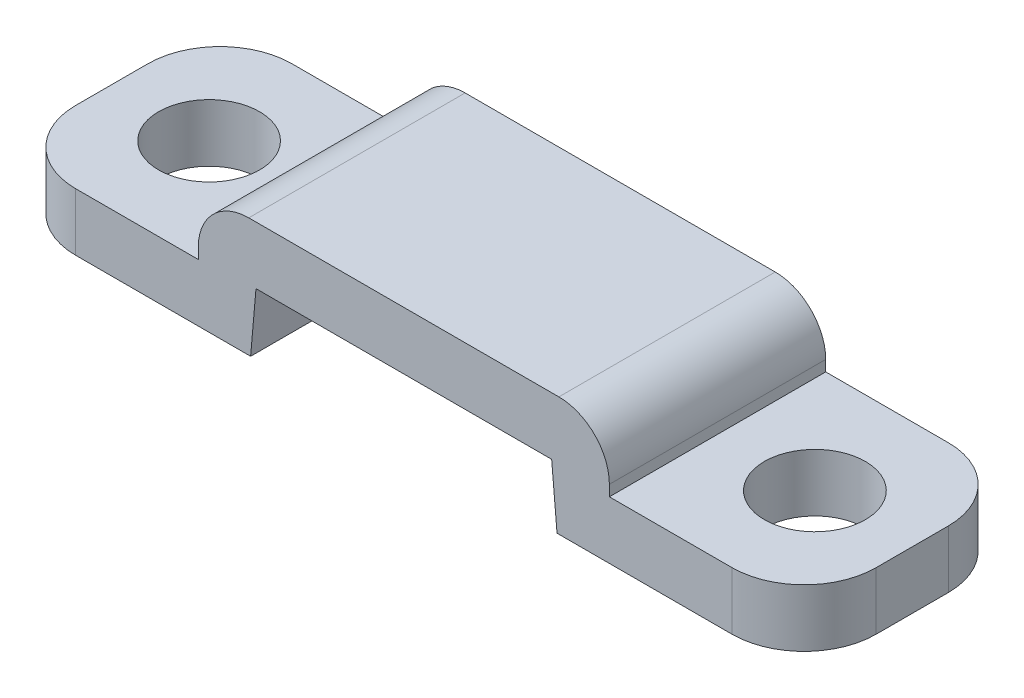
ISO-10303-21;
HEADER;
FILE_DESCRIPTION(('STEP AP214'),'2;1');
FILE_NAME('part.step','',(''),(''),'','','');
FILE_SCHEMA(('AUTOMOTIVE_DESIGN { 1 0 10303 214 1 1 1 1 }'));
ENDSEC;
DATA;
#1=APPLICATION_CONTEXT('core data for automotive mechanical design processes');
#2=APPLICATION_PROTOCOL_DEFINITION('international standard','automotive_design',2000,#1);
#3=PRODUCT_CONTEXT('',#1,'mechanical');
#4=PRODUCT('Part','Part','',(#3));
#5=PRODUCT_RELATED_PRODUCT_CATEGORY('part','',(#4));
#6=PRODUCT_DEFINITION_FORMATION('','',#4);
#7=PRODUCT_DEFINITION_CONTEXT('part definition',#1,'design');
#8=PRODUCT_DEFINITION('design','',#6,#7);
#9=PRODUCT_DEFINITION_SHAPE('','',#8);
#10=(LENGTH_UNIT() NAMED_UNIT(*) SI_UNIT(.MILLI.,.METRE.));
#11=(NAMED_UNIT(*) PLANE_ANGLE_UNIT() SI_UNIT($,.RADIAN.));
#12=(NAMED_UNIT(*) SI_UNIT($,.STERADIAN.) SOLID_ANGLE_UNIT());
#13=UNCERTAINTY_MEASURE_WITH_UNIT(LENGTH_MEASURE(1.E-05),#10,'distance_accuracy_value','');
#14=(GEOMETRIC_REPRESENTATION_CONTEXT(3) GLOBAL_UNCERTAINTY_ASSIGNED_CONTEXT((#13)) GLOBAL_UNIT_ASSIGNED_CONTEXT((#10,
#11,#12)) REPRESENTATION_CONTEXT('',''));
#15=CARTESIAN_POINT('',(0.,0.,0.));
#16=DIRECTION('',(0.,0.,1.));
#17=DIRECTION('',(1.,0.,0.));
#18=AXIS2_PLACEMENT_3D('',#15,#16,#17);
#19=CARTESIAN_POINT('',(5.207,-1.0795,7.62));
#20=DIRECTION('',(0.,1.,0.));
#21=DIRECTION('',(0.,0.,1.));
#22=AXIS2_PLACEMENT_3D('',#19,#20,#21);
#23=PLANE('',#22);
#24=CARTESIAN_POINT('',(10.668,-1.0795,3.81));
#25=DIRECTION('',(0.,1.,0.));
#26=DIRECTION('',(-1.,0.,0.));
#27=AXIS2_PLACEMENT_3D('',#24,#25,#26);
#28=CIRCLE('',#27,1.778);
#29=CARTESIAN_POINT('',(8.89,-1.0795,3.81));
#30=VERTEX_POINT('',#29);
#31=EDGE_CURVE('E417',#30,#30,#28,.T.);
#32=ORIENTED_EDGE('',*,*,#31,.T.);
#33=EDGE_LOOP('',(#32));
#34=FACE_BOUND('',#33,.T.);
#35=DIRECTION('',(0.,0.,-1.));
#36=VECTOR('',#35,1.);
#37=CARTESIAN_POINT('',(14.097,-1.0795,7.62));
#38=LINE('',#37,#36);
#39=CARTESIAN_POINT('',(14.097,-1.0795,5.08));
#40=VERTEX_POINT('',#39);
#41=CARTESIAN_POINT('',(14.097,-1.0795,2.54));
#42=VERTEX_POINT('',#41);
#43=EDGE_CURVE('E227',#40,#42,#38,.T.);
#44=ORIENTED_EDGE('',*,*,#43,.F.);
#45=CARTESIAN_POINT('',(11.557,-1.0795,5.08));
#46=DIRECTION('',(0.,1.,0.));
#47=DIRECTION('',(0.,0.,1.));
#48=AXIS2_PLACEMENT_3D('',#45,#46,#47);
#49=CIRCLE('',#48,2.54);
#50=CARTESIAN_POINT('',(11.557,-1.0795,7.62));
#51=VERTEX_POINT('',#50);
#52=EDGE_CURVE('E247',#40,#51,#49,.F.);
#53=ORIENTED_EDGE('',*,*,#52,.T.);
#54=DIRECTION('',(1.,0.,0.));
#55=VECTOR('',#54,1.);
#56=CARTESIAN_POINT('',(5.207,-1.0795,7.62));
#57=LINE('',#56,#55);
#58=CARTESIAN_POINT('',(5.39588802455247,-1.0795,7.62));
#59=VERTEX_POINT('',#58);
#60=EDGE_CURVE('E190',#59,#51,#57,.T.);
#61=ORIENTED_EDGE('',*,*,#60,.F.);
#62=DIRECTION('',(0.,0.,1.));
#63=VECTOR('',#62,1.);
#64=CARTESIAN_POINT('',(5.39588802455247,-1.0795,7.62));
#65=LINE('',#64,#63);
#66=CARTESIAN_POINT('',(5.39588802455247,-1.0795,0.));
#67=VERTEX_POINT('',#66);
#68=EDGE_CURVE('E194',#59,#67,#65,.F.);
#69=ORIENTED_EDGE('',*,*,#68,.T.);
#70=DIRECTION('',(1.,0.,0.));
#71=VECTOR('',#70,1.);
#72=CARTESIAN_POINT('',(5.207,-1.0795,0.));
#73=LINE('',#72,#71);
#74=CARTESIAN_POINT('',(11.557,-1.0795,0.));
#75=VERTEX_POINT('',#74);
#76=EDGE_CURVE('E296',#67,#75,#73,.T.);
#77=ORIENTED_EDGE('',*,*,#76,.T.);
#78=CARTESIAN_POINT('',(11.557,-1.0795,2.54));
#79=DIRECTION('',(0.,1.,0.));
#80=DIRECTION('',(0.,0.,1.));
#81=AXIS2_PLACEMENT_3D('',#78,#79,#80);
#82=CIRCLE('',#81,2.54);
#83=EDGE_CURVE('E245',#75,#42,#82,.F.);
#84=ORIENTED_EDGE('',*,*,#83,.T.);
#85=EDGE_LOOP('',(#44,#53,#61,#69,#77,#84));
#86=FACE_BOUND('',#85,.T.);
#87=ADVANCED_FACE('F33',(#34,#86),#23,.F.);
#88=CARTESIAN_POINT('',(14.097,-1.0795,7.62));
#89=DIRECTION('',(-1.,0.,0.));
#90=DIRECTION('',(0.,0.,1.));
#91=AXIS2_PLACEMENT_3D('',#88,#89,#90);
#92=PLANE('',#91);
#93=DIRECTION('',(0.,0.,-1.));
#94=VECTOR('',#93,1.);
#95=CARTESIAN_POINT('',(14.097,0.952499999999998,7.62));
#96=LINE('',#95,#94);
#97=CARTESIAN_POINT('',(14.097,0.952499999999998,5.08));
#98=VERTEX_POINT('',#97);
#99=CARTESIAN_POINT('',(14.097,0.952499999999998,2.54));
#100=VERTEX_POINT('',#99);
#101=EDGE_CURVE('E224',#98,#100,#96,.T.);
#102=ORIENTED_EDGE('',*,*,#101,.F.);
#103=DIRECTION('',(0.,1.,0.));
#104=VECTOR('',#103,1.);
#105=CARTESIAN_POINT('',(14.097,-1.0795,5.08));
#106=LINE('',#105,#104);
#107=EDGE_CURVE('E243',#98,#40,#106,.F.);
#108=ORIENTED_EDGE('',*,*,#107,.T.);
#109=ORIENTED_EDGE('',*,*,#43,.T.);
#110=DIRECTION('',(0.,1.,0.));
#111=VECTOR('',#110,1.);
#112=CARTESIAN_POINT('',(14.097,-1.0795,2.54));
#113=LINE('',#112,#111);
#114=EDGE_CURVE('E240',#42,#100,#113,.T.);
#115=ORIENTED_EDGE('',*,*,#114,.T.);
#116=EDGE_LOOP('',(#102,#108,#109,#115));
#117=FACE_BOUND('',#116,.T.);
#118=ADVANCED_FACE('F323',(#117),#92,.F.);
#119=CARTESIAN_POINT('',(14.097,0.952499999999998,7.62));
#120=DIRECTION('',(0.,-1.,0.));
#121=DIRECTION('',(1.,0.,0.));
#122=AXIS2_PLACEMENT_3D('',#119,#120,#121);
#123=PLANE('',#122);
#124=CARTESIAN_POINT('',(10.668,0.952499999999999,3.81));
#125=DIRECTION('',(0.,1.,0.));
#126=DIRECTION('',(-1.,0.,0.));
#127=AXIS2_PLACEMENT_3D('',#124,#125,#126);
#128=CIRCLE('',#127,1.778);
#129=CARTESIAN_POINT('',(8.89,0.952499999999998,3.81));
#130=VERTEX_POINT('',#129);
#131=EDGE_CURVE('E420',#130,#130,#128,.T.);
#132=ORIENTED_EDGE('',*,*,#131,.F.);
#133=EDGE_LOOP('',(#132));
#134=FACE_BOUND('',#133,.T.);
#135=DIRECTION('',(-1.,0.,0.));
#136=VECTOR('',#135,1.);
#137=CARTESIAN_POINT('',(14.097,0.952499999999998,7.62));
#138=LINE('',#137,#136);
#139=CARTESIAN_POINT('',(11.557,0.952499999999998,7.62));
#140=VERTEX_POINT('',#139);
#141=CARTESIAN_POINT('',(7.239,0.952499999999997,7.62));
#142=VERTEX_POINT('',#141);
#143=EDGE_CURVE('E329',#140,#142,#138,.T.);
#144=ORIENTED_EDGE('',*,*,#143,.F.);
#145=CARTESIAN_POINT('',(11.557,0.952499999999998,5.08));
#146=DIRECTION('',(0.,-1.,0.));
#147=DIRECTION('',(1.,0.,0.));
#148=AXIS2_PLACEMENT_3D('',#145,#146,#147);
#149=CIRCLE('',#148,2.54);
#150=EDGE_CURVE('E238',#140,#98,#149,.F.);
#151=ORIENTED_EDGE('',*,*,#150,.T.);
#152=ORIENTED_EDGE('',*,*,#101,.T.);
#153=CARTESIAN_POINT('',(11.557,0.952499999999998,2.54));
#154=DIRECTION('',(0.,-1.,0.));
#155=DIRECTION('',(1.,0.,0.));
#156=AXIS2_PLACEMENT_3D('',#153,#154,#155);
#157=CIRCLE('',#156,2.54);
#158=CARTESIAN_POINT('',(11.557,0.952499999999998,0.));
#159=VERTEX_POINT('',#158);
#160=EDGE_CURVE('E236',#100,#159,#157,.F.);
#161=ORIENTED_EDGE('',*,*,#160,.T.);
#162=DIRECTION('',(-1.,0.,0.));
#163=VECTOR('',#162,1.);
#164=CARTESIAN_POINT('',(14.097,0.952499999999998,0.));
#165=LINE('',#164,#163);
#166=CARTESIAN_POINT('',(7.239,0.952499999999997,0.));
#167=VERTEX_POINT('',#166);
#168=EDGE_CURVE('E179',#159,#167,#165,.T.);
#169=ORIENTED_EDGE('',*,*,#168,.T.);
#170=DIRECTION('',(0.,0.,-1.));
#171=VECTOR('',#170,1.);
#172=CARTESIAN_POINT('',(7.239,0.952499999999997,7.62));
#173=LINE('',#172,#171);
#174=EDGE_CURVE('E178',#142,#167,#173,.T.);
#175=ORIENTED_EDGE('',*,*,#174,.F.);
#176=EDGE_LOOP('',(#144,#151,#152,#161,#169,#175));
#177=FACE_BOUND('',#176,.T.);
#178=ADVANCED_FACE('F327',(#134,#177),#123,.F.);
#179=CARTESIAN_POINT('',(7.239,3.1115,7.62));
#180=DIRECTION('',(-1.,0.,0.));
#181=DIRECTION('',(0.,0.,1.));
#182=AXIS2_PLACEMENT_3D('',#179,#180,#181);
#183=PLANE('',#182);
#184=DIRECTION('',(0.,1.,0.));
#185=VECTOR('',#184,1.);
#186=CARTESIAN_POINT('',(7.239,3.1115,0.));
#187=LINE('',#186,#185);
#188=CARTESIAN_POINT('',(7.239,1.3335,0.));
#189=VERTEX_POINT('',#188);
#190=EDGE_CURVE('E162',#167,#189,#187,.T.);
#191=ORIENTED_EDGE('',*,*,#190,.T.);
#192=DIRECTION('',(0.,0.,-1.));
#193=VECTOR('',#192,1.);
#194=CARTESIAN_POINT('',(7.239,1.3335,7.62));
#195=LINE('',#194,#193);
#196=CARTESIAN_POINT('',(7.239,1.3335,7.62));
#197=VERTEX_POINT('',#196);
#198=EDGE_CURVE('E169',#189,#197,#195,.F.);
#199=ORIENTED_EDGE('',*,*,#198,.T.);
#200=DIRECTION('',(0.,1.,0.));
#201=VECTOR('',#200,1.);
#202=CARTESIAN_POINT('',(7.239,3.1115,7.62));
#203=LINE('',#202,#201);
#204=EDGE_CURVE('E288',#142,#197,#203,.T.);
#205=ORIENTED_EDGE('',*,*,#204,.F.);
#206=ORIENTED_EDGE('',*,*,#174,.T.);
#207=EDGE_LOOP('',(#191,#199,#205,#206));
#208=FACE_BOUND('',#207,.T.);
#209=ADVANCED_FACE('F174',(#208),#183,.F.);
#210=CARTESIAN_POINT('',(-7.239,3.1115,7.62));
#211=DIRECTION('',(0.,-1.,0.));
#212=DIRECTION('',(0.,0.,-1.));
#213=AXIS2_PLACEMENT_3D('',#210,#211,#212);
#214=PLANE('',#213);
#215=DIRECTION('',(-1.,0.,0.));
#216=VECTOR('',#215,1.);
#217=CARTESIAN_POINT('',(-7.239,3.1115,7.62));
#218=LINE('',#217,#216);
#219=CARTESIAN_POINT('',(5.461,3.1115,7.62));
#220=VERTEX_POINT('',#219);
#221=CARTESIAN_POINT('',(-5.461,3.1115,7.62));
#222=VERTEX_POINT('',#221);
#223=EDGE_CURVE('E284',#220,#222,#218,.T.);
#224=ORIENTED_EDGE('',*,*,#223,.F.);
#225=DIRECTION('',(0.,0.,-1.));
#226=VECTOR('',#225,1.);
#227=CARTESIAN_POINT('',(5.461,3.1115,7.62));
#228=LINE('',#227,#226);
#229=CARTESIAN_POINT('',(5.461,3.1115,0.));
#230=VERTEX_POINT('',#229);
#231=EDGE_CURVE('E268',#220,#230,#228,.T.);
#232=ORIENTED_EDGE('',*,*,#231,.T.);
#233=DIRECTION('',(-1.,0.,0.));
#234=VECTOR('',#233,1.);
#235=CARTESIAN_POINT('',(-7.239,3.1115,0.));
#236=LINE('',#235,#234);
#237=CARTESIAN_POINT('',(-5.461,3.1115,0.));
#238=VERTEX_POINT('',#237);
#239=EDGE_CURVE('E164',#230,#238,#236,.T.);
#240=ORIENTED_EDGE('',*,*,#239,.T.);
#241=DIRECTION('',(0.,0.,-1.));
#242=VECTOR('',#241,1.);
#243=CARTESIAN_POINT('',(-5.461,3.1115,7.62));
#244=LINE('',#243,#242);
#245=EDGE_CURVE('E266',#238,#222,#244,.F.);
#246=ORIENTED_EDGE('',*,*,#245,.T.);
#247=EDGE_LOOP('',(#224,#232,#240,#246));
#248=FACE_BOUND('',#247,.T.);
#249=ADVANCED_FACE('F275',(#248),#214,.F.);
#250=CARTESIAN_POINT('',(-7.239,0.952499999999998,7.62));
#251=DIRECTION('',(1.,0.,0.));
#252=DIRECTION('',(0.,0.,-1.));
#253=AXIS2_PLACEMENT_3D('',#250,#251,#252);
#254=PLANE('',#253);
#255=DIRECTION('',(0.,-1.,0.));
#256=VECTOR('',#255,1.);
#257=CARTESIAN_POINT('',(-7.239,0.952499999999998,7.62));
#258=LINE('',#257,#256);
#259=CARTESIAN_POINT('',(-7.239,1.3335,7.62));
#260=VERTEX_POINT('',#259);
#261=CARTESIAN_POINT('',(-7.239,0.952499999999998,7.62));
#262=VERTEX_POINT('',#261);
#263=EDGE_CURVE('E279',#260,#262,#258,.T.);
#264=ORIENTED_EDGE('',*,*,#263,.F.);
#265=DIRECTION('',(0.,0.,-1.));
#266=VECTOR('',#265,1.);
#267=CARTESIAN_POINT('',(-7.239,1.3335,7.62));
#268=LINE('',#267,#266);
#269=CARTESIAN_POINT('',(-7.239,1.3335,0.));
#270=VERTEX_POINT('',#269);
#271=EDGE_CURVE('E11',#260,#270,#268,.T.);
#272=ORIENTED_EDGE('',*,*,#271,.T.);
#273=DIRECTION('',(0.,-1.,0.));
#274=VECTOR('',#273,1.);
#275=CARTESIAN_POINT('',(-7.239,0.952499999999998,0.));
#276=LINE('',#275,#274);
#277=CARTESIAN_POINT('',(-7.239,0.952499999999998,0.));
#278=VERTEX_POINT('',#277);
#279=EDGE_CURVE('E86',#270,#278,#276,.T.);
#280=ORIENTED_EDGE('',*,*,#279,.T.);
#281=DIRECTION('',(0.,0.,-1.));
#282=VECTOR('',#281,1.);
#283=CARTESIAN_POINT('',(-7.239,0.952499999999998,7.62));
#284=LINE('',#283,#282);
#285=EDGE_CURVE('E221',#262,#278,#284,.T.);
#286=ORIENTED_EDGE('',*,*,#285,.F.);
#287=EDGE_LOOP('',(#264,#272,#280,#286));
#288=FACE_BOUND('',#287,.T.);
#289=ADVANCED_FACE('F278',(#288),#254,.F.);
#290=CARTESIAN_POINT('',(-14.097,0.952499999999998,7.62));
#291=DIRECTION('',(0.,-1.,0.));
#292=DIRECTION('',(0.,0.,-1.));
#293=AXIS2_PLACEMENT_3D('',#290,#291,#292);
#294=PLANE('',#293);
#295=CARTESIAN_POINT('',(-10.668,0.952499999999997,3.81));
#296=DIRECTION('',(0.,1.,0.));
#297=DIRECTION('',(-1.,0.,0.));
#298=AXIS2_PLACEMENT_3D('',#295,#296,#297);
#299=CIRCLE('',#298,1.778);
#300=CARTESIAN_POINT('',(-12.446,0.952499999999997,3.81));
#301=VERTEX_POINT('',#300);
#302=EDGE_CURVE('E339',#301,#301,#299,.T.);
#303=ORIENTED_EDGE('',*,*,#302,.F.);
#304=EDGE_LOOP('',(#303));
#305=FACE_BOUND('',#304,.T.);
#306=DIRECTION('',(-1.,0.,0.));
#307=VECTOR('',#306,1.);
#308=CARTESIAN_POINT('',(-14.097,0.952499999999998,0.));
#309=LINE('',#308,#307);
#310=CARTESIAN_POINT('',(-11.557,0.952499999999998,0.));
#311=VERTEX_POINT('',#310);
#312=EDGE_CURVE('E302',#278,#311,#309,.T.);
#313=ORIENTED_EDGE('',*,*,#312,.T.);
#314=CARTESIAN_POINT('',(-11.557,0.952499999999998,2.54));
#315=DIRECTION('',(0.,-1.,0.));
#316=DIRECTION('',(0.,0.,-1.));
#317=AXIS2_PLACEMENT_3D('',#314,#315,#316);
#318=CIRCLE('',#317,2.54);
#319=CARTESIAN_POINT('',(-14.097,0.952499999999998,2.54));
#320=VERTEX_POINT('',#319);
#321=EDGE_CURVE('E264',#311,#320,#318,.F.);
#322=ORIENTED_EDGE('',*,*,#321,.T.);
#323=DIRECTION('',(0.,0.,-1.));
#324=VECTOR('',#323,1.);
#325=CARTESIAN_POINT('',(-14.097,0.952499999999998,7.62));
#326=LINE('',#325,#324);
#327=CARTESIAN_POINT('',(-14.097,0.952499999999998,5.08));
#328=VERTEX_POINT('',#327);
#329=EDGE_CURVE('E207',#328,#320,#326,.T.);
#330=ORIENTED_EDGE('',*,*,#329,.F.);
#331=CARTESIAN_POINT('',(-11.557,0.952499999999998,5.08));
#332=DIRECTION('',(0.,-1.,0.));
#333=DIRECTION('',(0.,0.,-1.));
#334=AXIS2_PLACEMENT_3D('',#331,#332,#333);
#335=CIRCLE('',#334,2.54);
#336=CARTESIAN_POINT('',(-11.557,0.952499999999998,7.62));
#337=VERTEX_POINT('',#336);
#338=EDGE_CURVE('E262',#328,#337,#335,.F.);
#339=ORIENTED_EDGE('',*,*,#338,.T.);
#340=DIRECTION('',(-1.,0.,0.));
#341=VECTOR('',#340,1.);
#342=CARTESIAN_POINT('',(-14.097,0.952499999999998,7.62));
#343=LINE('',#342,#341);
#344=EDGE_CURVE('E283',#262,#337,#343,.T.);
#345=ORIENTED_EDGE('',*,*,#344,.F.);
#346=ORIENTED_EDGE('',*,*,#285,.T.);
#347=EDGE_LOOP('',(#313,#322,#330,#339,#345,#346));
#348=FACE_BOUND('',#347,.T.);
#349=ADVANCED_FACE('F354',(#305,#348),#294,.F.);
#350=CARTESIAN_POINT('',(-14.097,-1.0795,7.62));
#351=DIRECTION('',(1.,0.,0.));
#352=DIRECTION('',(0.,1.,0.));
#353=AXIS2_PLACEMENT_3D('',#350,#351,#352);
#354=PLANE('',#353);
#355=ORIENTED_EDGE('',*,*,#329,.T.);
#356=DIRECTION('',(0.,-1.,0.));
#357=VECTOR('',#356,1.);
#358=CARTESIAN_POINT('',(-14.097,-1.0795,2.54));
#359=LINE('',#358,#357);
#360=CARTESIAN_POINT('',(-14.097,-1.0795,2.54));
#361=VERTEX_POINT('',#360);
#362=EDGE_CURVE('E255',#320,#361,#359,.T.);
#363=ORIENTED_EDGE('',*,*,#362,.T.);
#364=DIRECTION('',(0.,0.,-1.));
#365=VECTOR('',#364,1.);
#366=CARTESIAN_POINT('',(-14.097,-1.0795,7.62));
#367=LINE('',#366,#365);
#368=CARTESIAN_POINT('',(-14.097,-1.0795,5.08));
#369=VERTEX_POINT('',#368);
#370=EDGE_CURVE('E201',#369,#361,#367,.T.);
#371=ORIENTED_EDGE('',*,*,#370,.F.);
#372=DIRECTION('',(0.,-1.,0.));
#373=VECTOR('',#372,1.);
#374=CARTESIAN_POINT('',(-14.097,0.952499999999998,5.08));
#375=LINE('',#374,#373);
#376=EDGE_CURVE('E253',#369,#328,#375,.F.);
#377=ORIENTED_EDGE('',*,*,#376,.T.);
#378=EDGE_LOOP('',(#355,#363,#371,#377));
#379=FACE_BOUND('',#378,.T.);
#380=ADVANCED_FACE('F357',(#379),#354,.F.);
#381=CARTESIAN_POINT('',(-5.207,-1.0795,7.62));
#382=DIRECTION('',(0.,1.,0.));
#383=DIRECTION('',(-1.,0.,0.));
#384=AXIS2_PLACEMENT_3D('',#381,#382,#383);
#385=PLANE('',#384);
#386=CARTESIAN_POINT('',(-10.668,-1.0795,3.81));
#387=DIRECTION('',(0.,1.,0.));
#388=DIRECTION('',(-1.,0.,0.));
#389=AXIS2_PLACEMENT_3D('',#386,#387,#388);
#390=CIRCLE('',#389,1.778);
#391=CARTESIAN_POINT('',(-12.446,-1.0795,3.81));
#392=VERTEX_POINT('',#391);
#393=EDGE_CURVE('E299',#392,#392,#390,.T.);
#394=ORIENTED_EDGE('',*,*,#393,.T.);
#395=EDGE_LOOP('',(#394));
#396=FACE_BOUND('',#395,.T.);
#397=ORIENTED_EDGE('',*,*,#370,.T.);
#398=CARTESIAN_POINT('',(-11.557,-1.0795,2.54));
#399=DIRECTION('',(0.,1.,0.));
#400=DIRECTION('',(-1.,0.,0.));
#401=AXIS2_PLACEMENT_3D('',#398,#399,#400);
#402=CIRCLE('',#401,2.54);
#403=CARTESIAN_POINT('',(-11.557,-1.0795,0.));
#404=VERTEX_POINT('',#403);
#405=EDGE_CURVE('E260',#361,#404,#402,.F.);
#406=ORIENTED_EDGE('',*,*,#405,.T.);
#407=DIRECTION('',(1.,0.,0.));
#408=VECTOR('',#407,1.);
#409=CARTESIAN_POINT('',(-5.207,-1.0795,0.));
#410=LINE('',#409,#408);
#411=CARTESIAN_POINT('',(-5.39588802455247,-1.0795,0.));
#412=VERTEX_POINT('',#411);
#413=EDGE_CURVE('E76',#404,#412,#410,.T.);
#414=ORIENTED_EDGE('',*,*,#413,.T.);
#415=DIRECTION('',(0.,0.,1.));
#416=VECTOR('',#415,1.);
#417=CARTESIAN_POINT('',(-5.39588802455247,-1.0795,7.62));
#418=LINE('',#417,#416);
#419=CARTESIAN_POINT('',(-5.39588802455247,-1.0795,7.62));
#420=VERTEX_POINT('',#419);
#421=EDGE_CURVE('E200',#420,#412,#418,.F.);
#422=ORIENTED_EDGE('',*,*,#421,.F.);
#423=DIRECTION('',(1.,0.,0.));
#424=VECTOR('',#423,1.);
#425=CARTESIAN_POINT('',(-5.207,-1.0795,7.62));
#426=LINE('',#425,#424);
#427=CARTESIAN_POINT('',(-11.557,-1.0795,7.62));
#428=VERTEX_POINT('',#427);
#429=EDGE_CURVE('E286',#428,#420,#426,.T.);
#430=ORIENTED_EDGE('',*,*,#429,.F.);
#431=CARTESIAN_POINT('',(-11.557,-1.0795,5.08));
#432=DIRECTION('',(0.,1.,0.));
#433=DIRECTION('',(-1.,0.,0.));
#434=AXIS2_PLACEMENT_3D('',#431,#432,#433);
#435=CIRCLE('',#434,2.54);
#436=EDGE_CURVE('E258',#428,#369,#435,.F.);
#437=ORIENTED_EDGE('',*,*,#436,.T.);
#438=EDGE_LOOP('',(#397,#406,#414,#422,#430,#437));
#439=FACE_BOUND('',#438,.T.);
#440=ADVANCED_FACE('F363',(#396,#439),#385,.F.);
#441=CARTESIAN_POINT('',(-5.207,1.0795,7.62));
#442=DIRECTION('',(0.996194698091745,-0.0871557427476584,0.));
#443=DIRECTION('',(0.0871557427476584,0.996194698091746,0.));
#444=AXIS2_PLACEMENT_3D('',#441,#442,#443);
#445=PLANE('',#444);
#446=DIRECTION('',(-0.0871557427476584,-0.996194698091746,0.));
#447=VECTOR('',#446,1.);
#448=CARTESIAN_POINT('',(-5.207,1.0795,0.));
#449=LINE('',#448,#447);
#450=CARTESIAN_POINT('',(-5.207,1.0795,0.));
#451=VERTEX_POINT('',#450);
#452=EDGE_CURVE('E199',#412,#451,#449,.F.);
#453=ORIENTED_EDGE('',*,*,#452,.T.);
#454=DIRECTION('',(0.,0.,-1.));
#455=VECTOR('',#454,1.);
#456=CARTESIAN_POINT('',(-5.207,1.0795,7.62));
#457=LINE('',#456,#455);
#458=CARTESIAN_POINT('',(-5.207,1.0795,7.62));
#459=VERTEX_POINT('',#458);
#460=EDGE_CURVE('E202',#459,#451,#457,.T.);
#461=ORIENTED_EDGE('',*,*,#460,.F.);
#462=DIRECTION('',(-0.0871557427476584,-0.996194698091746,0.));
#463=VECTOR('',#462,1.);
#464=CARTESIAN_POINT('',(-5.207,1.0795,7.62));
#465=LINE('',#464,#463);
#466=EDGE_CURVE('E37',#420,#459,#465,.F.);
#467=ORIENTED_EDGE('',*,*,#466,.F.);
#468=ORIENTED_EDGE('',*,*,#421,.T.);
#469=EDGE_LOOP('',(#453,#461,#467,#468));
#470=FACE_BOUND('',#469,.T.);
#471=ADVANCED_FACE('F35',(#470),#445,.T.);
#472=CARTESIAN_POINT('',(-5.207,1.0795,7.62));
#473=DIRECTION('',(0.,1.,0.));
#474=DIRECTION('',(0.,0.,1.));
#475=AXIS2_PLACEMENT_3D('',#472,#473,#474);
#476=PLANE('',#475);
#477=DIRECTION('',(1.,0.,0.));
#478=VECTOR('',#477,1.);
#479=CARTESIAN_POINT('',(-5.207,1.0795,0.));
#480=LINE('',#479,#478);
#481=CARTESIAN_POINT('',(5.207,1.0795,0.));
#482=VERTEX_POINT('',#481);
#483=EDGE_CURVE('E191',#451,#482,#480,.T.);
#484=ORIENTED_EDGE('',*,*,#483,.T.);
#485=DIRECTION('',(0.,0.,-1.));
#486=VECTOR('',#485,1.);
#487=CARTESIAN_POINT('',(5.207,1.0795,7.62));
#488=LINE('',#487,#486);
#489=CARTESIAN_POINT('',(5.207,1.0795,7.62));
#490=VERTEX_POINT('',#489);
#491=EDGE_CURVE('E198',#490,#482,#488,.T.);
#492=ORIENTED_EDGE('',*,*,#491,.F.);
#493=DIRECTION('',(1.,0.,0.));
#494=VECTOR('',#493,1.);
#495=CARTESIAN_POINT('',(-5.207,1.0795,7.62));
#496=LINE('',#495,#494);
#497=EDGE_CURVE('E195',#459,#490,#496,.T.);
#498=ORIENTED_EDGE('',*,*,#497,.F.);
#499=ORIENTED_EDGE('',*,*,#460,.T.);
#500=EDGE_LOOP('',(#484,#492,#498,#499));
#501=FACE_BOUND('',#500,.T.);
#502=ADVANCED_FACE('F306',(#501),#476,.F.);
#503=CARTESIAN_POINT('',(5.207,1.0795,7.62));
#504=DIRECTION('',(-0.996194698091745,-0.0871557427476584,0.));
#505=DIRECTION('',(0.0871557427476584,-0.996194698091746,0.));
#506=AXIS2_PLACEMENT_3D('',#503,#504,#505);
#507=PLANE('',#506);
#508=DIRECTION('',(-0.0871557427476584,0.996194698091746,0.));
#509=VECTOR('',#508,1.);
#510=CARTESIAN_POINT('',(5.207,1.0795,0.));
#511=LINE('',#510,#509);
#512=EDGE_CURVE('E188',#482,#67,#511,.F.);
#513=ORIENTED_EDGE('',*,*,#512,.T.);
#514=ORIENTED_EDGE('',*,*,#68,.F.);
#515=DIRECTION('',(-0.0871557427476584,0.996194698091746,0.));
#516=VECTOR('',#515,1.);
#517=CARTESIAN_POINT('',(5.207,1.0795,7.62));
#518=LINE('',#517,#516);
#519=EDGE_CURVE('E192',#490,#59,#518,.F.);
#520=ORIENTED_EDGE('',*,*,#519,.F.);
#521=ORIENTED_EDGE('',*,*,#491,.T.);
#522=EDGE_LOOP('',(#513,#514,#520,#521));
#523=FACE_BOUND('',#522,.T.);
#524=ADVANCED_FACE('F310',(#523),#507,.T.);
#525=CARTESIAN_POINT('',(0.,0.,7.62));
#526=DIRECTION('',(0.,0.,1.));
#527=DIRECTION('',(1.,0.,0.));
#528=AXIS2_PLACEMENT_3D('',#525,#526,#527);
#529=PLANE('',#528);
#530=ORIENTED_EDGE('',*,*,#204,.T.);
#531=CARTESIAN_POINT('',(5.461,1.3335,7.62));
#532=DIRECTION('',(0.,0.,1.));
#533=DIRECTION('',(1.,0.,0.));
#534=AXIS2_PLACEMENT_3D('',#531,#532,#533);
#535=CIRCLE('',#534,1.778);
#536=EDGE_CURVE('E43',#197,#220,#535,.T.);
#537=ORIENTED_EDGE('',*,*,#536,.T.);
#538=ORIENTED_EDGE('',*,*,#223,.T.);
#539=CARTESIAN_POINT('',(-5.461,1.3335,7.62));
#540=DIRECTION('',(0.,0.,1.));
#541=DIRECTION('',(1.,0.,0.));
#542=AXIS2_PLACEMENT_3D('',#539,#540,#541);
#543=CIRCLE('',#542,1.778);
#544=EDGE_CURVE('E52',#222,#260,#543,.T.);
#545=ORIENTED_EDGE('',*,*,#544,.T.);
#546=ORIENTED_EDGE('',*,*,#263,.T.);
#547=ORIENTED_EDGE('',*,*,#344,.T.);
#548=DIRECTION('',(0.,-1.,0.));
#549=VECTOR('',#548,1.);
#550=CARTESIAN_POINT('',(-11.557,-1.0795,7.62));
#551=LINE('',#550,#549);
#552=EDGE_CURVE('E230',#337,#428,#551,.T.);
#553=ORIENTED_EDGE('',*,*,#552,.T.);
#554=ORIENTED_EDGE('',*,*,#429,.T.);
#555=ORIENTED_EDGE('',*,*,#466,.T.);
#556=ORIENTED_EDGE('',*,*,#497,.T.);
#557=ORIENTED_EDGE('',*,*,#519,.T.);
#558=ORIENTED_EDGE('',*,*,#60,.T.);
#559=DIRECTION('',(0.,1.,0.));
#560=VECTOR('',#559,1.);
#561=CARTESIAN_POINT('',(11.557,0.952499999999998,7.62));
#562=LINE('',#561,#560);
#563=EDGE_CURVE('E233',#51,#140,#562,.T.);
#564=ORIENTED_EDGE('',*,*,#563,.T.);
#565=ORIENTED_EDGE('',*,*,#143,.T.);
#566=EDGE_LOOP('',(#530,#537,#538,#545,#546,#547,#553,#554,#555,#556,#557,#558,#564,#565));
#567=FACE_BOUND('',#566,.T.);
#568=ADVANCED_FACE('F335',(#567),#529,.T.);
#569=CARTESIAN_POINT('',(0.,0.,0.));
#570=DIRECTION('',(0.,0.,1.));
#571=DIRECTION('',(1.,0.,0.));
#572=AXIS2_PLACEMENT_3D('',#569,#570,#571);
#573=PLANE('',#572);
#574=ORIENTED_EDGE('',*,*,#239,.F.);
#575=CARTESIAN_POINT('',(5.461,1.3335,0.));
#576=DIRECTION('',(0.,0.,1.));
#577=DIRECTION('',(1.,0.,0.));
#578=AXIS2_PLACEMENT_3D('',#575,#576,#577);
#579=CIRCLE('',#578,1.778);
#580=EDGE_CURVE('E158',#230,#189,#579,.F.);
#581=ORIENTED_EDGE('',*,*,#580,.T.);
#582=ORIENTED_EDGE('',*,*,#190,.F.);
#583=ORIENTED_EDGE('',*,*,#168,.F.);
#584=DIRECTION('',(0.,1.,0.));
#585=VECTOR('',#584,1.);
#586=CARTESIAN_POINT('',(11.557,0.,0.));
#587=LINE('',#586,#585);
#588=EDGE_CURVE('E251',#159,#75,#587,.F.);
#589=ORIENTED_EDGE('',*,*,#588,.T.);
#590=ORIENTED_EDGE('',*,*,#76,.F.);
#591=ORIENTED_EDGE('',*,*,#512,.F.);
#592=ORIENTED_EDGE('',*,*,#483,.F.);
#593=ORIENTED_EDGE('',*,*,#452,.F.);
#594=ORIENTED_EDGE('',*,*,#413,.F.);
#595=DIRECTION('',(0.,-1.,0.));
#596=VECTOR('',#595,1.);
#597=CARTESIAN_POINT('',(-11.557,0.,0.));
#598=LINE('',#597,#596);
#599=EDGE_CURVE('E249',#404,#311,#598,.F.);
#600=ORIENTED_EDGE('',*,*,#599,.T.);
#601=ORIENTED_EDGE('',*,*,#312,.F.);
#602=ORIENTED_EDGE('',*,*,#279,.F.);
#603=CARTESIAN_POINT('',(-5.461,1.3335,0.));
#604=DIRECTION('',(0.,0.,1.));
#605=DIRECTION('',(1.,0.,0.));
#606=AXIS2_PLACEMENT_3D('',#603,#604,#605);
#607=CIRCLE('',#606,1.778);
#608=EDGE_CURVE('E170',#270,#238,#607,.F.);
#609=ORIENTED_EDGE('',*,*,#608,.T.);
#610=EDGE_LOOP('',(#574,#581,#582,#583,#589,#590,#591,#592,#593,#594,#600,#601,#602,#609));
#611=FACE_BOUND('',#610,.T.);
#612=ADVANCED_FACE('F160',(#611),#573,.F.);
#613=CARTESIAN_POINT('',(-10.668,-1.0795,3.81));
#614=DIRECTION('',(0.,1.,0.));
#615=DIRECTION('',(-1.,0.,0.));
#616=AXIS2_PLACEMENT_3D('',#613,#614,#615);
#617=CYLINDRICAL_SURFACE('',#616,1.778);
#618=ORIENTED_EDGE('',*,*,#393,.F.);
#619=EDGE_LOOP('',(#618));
#620=FACE_BOUND('',#619,.T.);
#621=ORIENTED_EDGE('',*,*,#302,.T.);
#622=EDGE_LOOP('',(#621));
#623=FACE_BOUND('',#622,.T.);
#624=ADVANCED_FACE('F406',(#620,#623),#617,.F.);
#625=CARTESIAN_POINT('',(10.668,-1.0795,3.81));
#626=DIRECTION('',(0.,1.,0.));
#627=DIRECTION('',(-1.,0.,0.));
#628=AXIS2_PLACEMENT_3D('',#625,#626,#627);
#629=CYLINDRICAL_SURFACE('',#628,1.778);
#630=ORIENTED_EDGE('',*,*,#31,.F.);
#631=EDGE_LOOP('',(#630));
#632=FACE_BOUND('',#631,.T.);
#633=ORIENTED_EDGE('',*,*,#131,.T.);
#634=EDGE_LOOP('',(#633));
#635=FACE_BOUND('',#634,.T.);
#636=ADVANCED_FACE('F386',(#632,#635),#629,.F.);
#637=CARTESIAN_POINT('',(11.557,0.,5.08));
#638=DIRECTION('',(0.,-1.,0.));
#639=DIRECTION('',(0.,0.,-1.));
#640=AXIS2_PLACEMENT_3D('',#637,#638,#639);
#641=CYLINDRICAL_SURFACE('',#640,2.54);
#642=ORIENTED_EDGE('',*,*,#52,.F.);
#643=ORIENTED_EDGE('',*,*,#107,.F.);
#644=ORIENTED_EDGE('',*,*,#150,.F.);
#645=ORIENTED_EDGE('',*,*,#563,.F.);
#646=EDGE_LOOP('',(#642,#643,#644,#645));
#647=FACE_BOUND('',#646,.T.);
#648=ADVANCED_FACE('F333',(#647),#641,.T.);
#649=CARTESIAN_POINT('',(11.557,-1.0795,2.54));
#650=DIRECTION('',(0.,1.,0.));
#651=DIRECTION('',(0.,0.,1.));
#652=AXIS2_PLACEMENT_3D('',#649,#650,#651);
#653=CYLINDRICAL_SURFACE('',#652,2.54);
#654=ORIENTED_EDGE('',*,*,#83,.F.);
#655=ORIENTED_EDGE('',*,*,#588,.F.);
#656=ORIENTED_EDGE('',*,*,#160,.F.);
#657=ORIENTED_EDGE('',*,*,#114,.F.);
#658=EDGE_LOOP('',(#654,#655,#656,#657));
#659=FACE_BOUND('',#658,.T.);
#660=ADVANCED_FACE('F320',(#659),#653,.T.);
#661=CARTESIAN_POINT('',(-11.557,-1.0795,2.54));
#662=DIRECTION('',(0.,-1.,0.));
#663=DIRECTION('',(1.,0.,0.));
#664=AXIS2_PLACEMENT_3D('',#661,#662,#663);
#665=CYLINDRICAL_SURFACE('',#664,2.54);
#666=ORIENTED_EDGE('',*,*,#321,.F.);
#667=ORIENTED_EDGE('',*,*,#599,.F.);
#668=ORIENTED_EDGE('',*,*,#405,.F.);
#669=ORIENTED_EDGE('',*,*,#362,.F.);
#670=EDGE_LOOP('',(#666,#667,#668,#669));
#671=FACE_BOUND('',#670,.T.);
#672=ADVANCED_FACE('F350',(#671),#665,.T.);
#673=CARTESIAN_POINT('',(-11.557,0.,5.08));
#674=DIRECTION('',(0.,1.,0.));
#675=DIRECTION('',(-1.,0.,0.));
#676=AXIS2_PLACEMENT_3D('',#673,#674,#675);
#677=CYLINDRICAL_SURFACE('',#676,2.54);
#678=ORIENTED_EDGE('',*,*,#338,.F.);
#679=ORIENTED_EDGE('',*,*,#376,.F.);
#680=ORIENTED_EDGE('',*,*,#436,.F.);
#681=ORIENTED_EDGE('',*,*,#552,.F.);
#682=EDGE_LOOP('',(#678,#679,#680,#681));
#683=FACE_BOUND('',#682,.T.);
#684=ADVANCED_FACE('F361',(#683),#677,.T.);
#685=CARTESIAN_POINT('',(5.461,1.3335,7.62));
#686=DIRECTION('',(0.,0.,-1.));
#687=DIRECTION('',(-1.,0.,0.));
#688=AXIS2_PLACEMENT_3D('',#685,#686,#687);
#689=CYLINDRICAL_SURFACE('',#688,1.778);
#690=ORIENTED_EDGE('',*,*,#536,.F.);
#691=ORIENTED_EDGE('',*,*,#198,.F.);
#692=ORIENTED_EDGE('',*,*,#580,.F.);
#693=ORIENTED_EDGE('',*,*,#231,.F.);
#694=EDGE_LOOP('',(#690,#691,#692,#693));
#695=FACE_BOUND('',#694,.T.);
#696=ADVANCED_FACE('F182',(#695),#689,.T.);
#697=CARTESIAN_POINT('',(-5.461,1.3335,7.62));
#698=DIRECTION('',(0.,0.,-1.));
#699=DIRECTION('',(-1.,0.,0.));
#700=AXIS2_PLACEMENT_3D('',#697,#698,#699);
#701=CYLINDRICAL_SURFACE('',#700,1.778);
#702=ORIENTED_EDGE('',*,*,#544,.F.);
#703=ORIENTED_EDGE('',*,*,#245,.F.);
#704=ORIENTED_EDGE('',*,*,#608,.F.);
#705=ORIENTED_EDGE('',*,*,#271,.F.);
#706=EDGE_LOOP('',(#702,#703,#704,#705));
#707=FACE_BOUND('',#706,.T.);
#708=ADVANCED_FACE('F277',(#707),#701,.T.);
#709=CLOSED_SHELL('',(#87,#118,#178,#209,#249,#289,#349,#380,#440,#471,#502,#524,#568,#612,#624,
#636,#648,#660,#672,#684,#696,#708));
#710=MANIFOLD_SOLID_BREP('B2',#709);
#711=ADVANCED_BREP_SHAPE_REPRESENTATION('',(#18,#710),#14);
#712=SHAPE_DEFINITION_REPRESENTATION(#9,#711);
ENDSEC;
END-ISO-10303-21;
